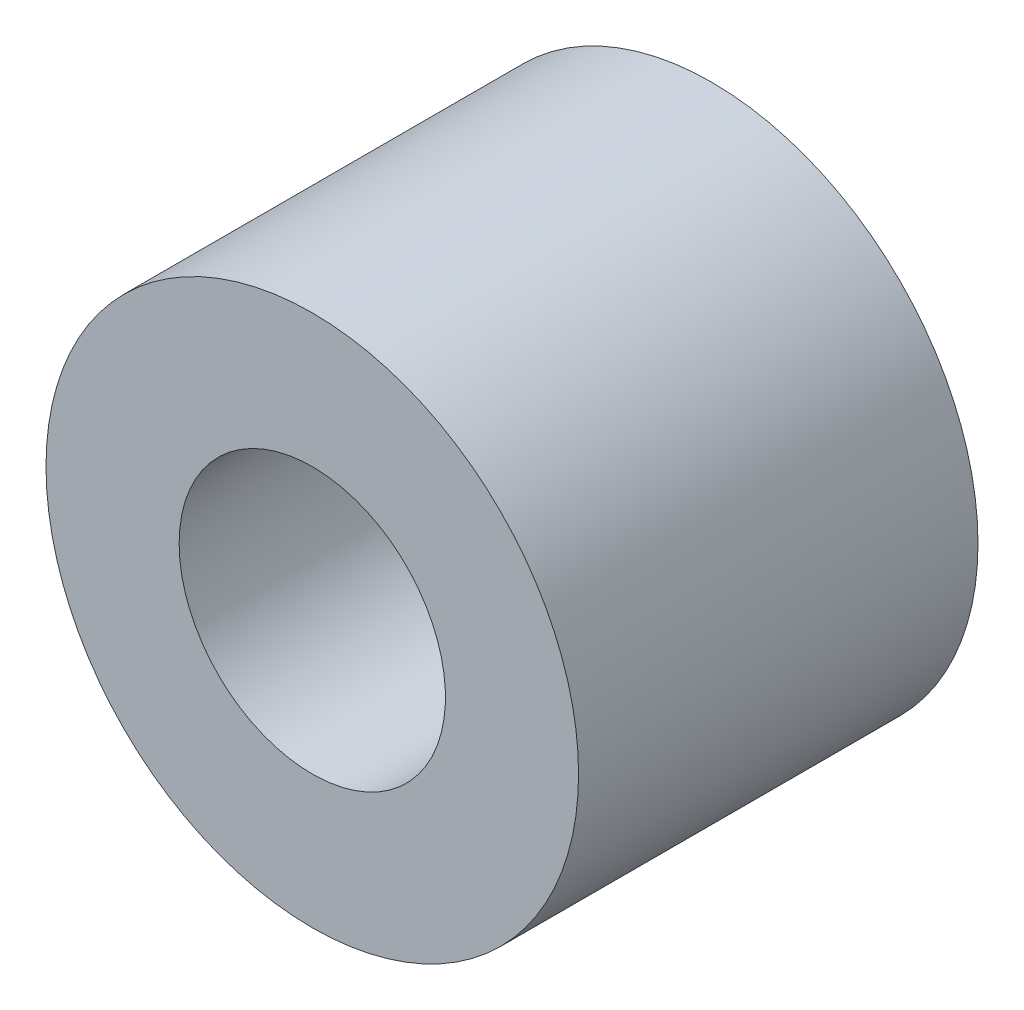
ISO-10303-21;
HEADER;
FILE_DESCRIPTION(('STEP AP214'),'2;1');
FILE_NAME('part.step','',(''),(''),'','','');
FILE_SCHEMA(('AUTOMOTIVE_DESIGN { 1 0 10303 214 1 1 1 1 }'));
ENDSEC;
DATA;
#1=APPLICATION_CONTEXT('core data for automotive mechanical design processes');
#2=APPLICATION_PROTOCOL_DEFINITION('international standard','automotive_design',2000,#1);
#3=PRODUCT_CONTEXT('',#1,'mechanical');
#4=PRODUCT('Part','Part','',(#3));
#5=PRODUCT_RELATED_PRODUCT_CATEGORY('part','',(#4));
#6=PRODUCT_DEFINITION_FORMATION('','',#4);
#7=PRODUCT_DEFINITION_CONTEXT('part definition',#1,'design');
#8=PRODUCT_DEFINITION('design','',#6,#7);
#9=PRODUCT_DEFINITION_SHAPE('','',#8);
#10=(LENGTH_UNIT() NAMED_UNIT(*) SI_UNIT(.MILLI.,.METRE.));
#11=(NAMED_UNIT(*) PLANE_ANGLE_UNIT() SI_UNIT($,.RADIAN.));
#12=(NAMED_UNIT(*) SI_UNIT($,.STERADIAN.) SOLID_ANGLE_UNIT());
#13=UNCERTAINTY_MEASURE_WITH_UNIT(LENGTH_MEASURE(1.E-05),#10,'distance_accuracy_value','');
#14=(GEOMETRIC_REPRESENTATION_CONTEXT(3) GLOBAL_UNCERTAINTY_ASSIGNED_CONTEXT((#13)) GLOBAL_UNIT_ASSIGNED_CONTEXT((#10,
#11,#12)) REPRESENTATION_CONTEXT('',''));
#15=CARTESIAN_POINT('',(0.,0.,0.));
#16=DIRECTION('',(0.,0.,1.));
#17=DIRECTION('',(1.,0.,0.));
#18=AXIS2_PLACEMENT_3D('',#15,#16,#17);
#19=CARTESIAN_POINT('',(0.,0.,4.1671875));
#20=DIRECTION('',(0.,0.,1.));
#21=DIRECTION('',(1.,0.,0.));
#22=AXIS2_PLACEMENT_3D('',#19,#20,#21);
#23=PLANE('',#22);
#24=CARTESIAN_POINT('',(0.,0.,4.1671875));
#25=DIRECTION('',(0.,0.,1.));
#26=DIRECTION('',(1.,0.,0.));
#27=AXIS2_PLACEMENT_3D('',#24,#25,#26);
#28=CIRCLE('',#27,2.38125);
#29=CARTESIAN_POINT('',(-2.38125,0.,4.1671875));
#30=VERTEX_POINT('',#29);
#31=EDGE_CURVE('E10',#30,#30,#28,.T.);
#32=ORIENTED_EDGE('',*,*,#31,.T.);
#33=EDGE_LOOP('',(#32));
#34=FACE_BOUND('',#33,.T.);
#35=CARTESIAN_POINT('',(0.,0.,4.1671875));
#36=DIRECTION('',(0.,0.,1.));
#37=DIRECTION('',(1.,0.,0.));
#38=AXIS2_PLACEMENT_3D('',#35,#36,#37);
#39=CIRCLE('',#38,1.190625);
#40=CARTESIAN_POINT('',(-1.190625,0.,4.1671875));
#41=VERTEX_POINT('',#40);
#42=EDGE_CURVE('E49',#41,#41,#39,.T.);
#43=ORIENTED_EDGE('',*,*,#42,.F.);
#44=EDGE_LOOP('',(#43));
#45=FACE_BOUND('',#44,.T.);
#46=ADVANCED_FACE('F36',(#34,#45),#23,.T.);
#47=CARTESIAN_POINT('',(0.,0.,0.5953125));
#48=DIRECTION('',(0.,0.,1.));
#49=DIRECTION('',(1.,0.,0.));
#50=AXIS2_PLACEMENT_3D('',#47,#48,#49);
#51=PLANE('',#50);
#52=CARTESIAN_POINT('',(0.,0.,0.5953125));
#53=DIRECTION('',(0.,0.,1.));
#54=DIRECTION('',(1.,0.,0.));
#55=AXIS2_PLACEMENT_3D('',#52,#53,#54);
#56=CIRCLE('',#55,2.38125);
#57=CARTESIAN_POINT('',(-2.38125,0.,0.5953125));
#58=VERTEX_POINT('',#57);
#59=EDGE_CURVE('E40',#58,#58,#56,.T.);
#60=ORIENTED_EDGE('',*,*,#59,.F.);
#61=EDGE_LOOP('',(#60));
#62=FACE_BOUND('',#61,.T.);
#63=CARTESIAN_POINT('',(0.,0.,0.5953125));
#64=DIRECTION('',(0.,0.,1.));
#65=DIRECTION('',(1.,0.,0.));
#66=AXIS2_PLACEMENT_3D('',#63,#64,#65);
#67=CIRCLE('',#66,1.190625);
#68=CARTESIAN_POINT('',(-1.190625,0.,0.5953125));
#69=VERTEX_POINT('',#68);
#70=EDGE_CURVE('E51',#69,#69,#67,.T.);
#71=ORIENTED_EDGE('',*,*,#70,.T.);
#72=EDGE_LOOP('',(#71));
#73=FACE_BOUND('',#72,.T.);
#74=ADVANCED_FACE('F63',(#62,#73),#51,.F.);
#75=CARTESIAN_POINT('',(0.,0.,4.1671875));
#76=DIRECTION('',(0.,0.,-1.));
#77=DIRECTION('',(-1.,0.,0.));
#78=AXIS2_PLACEMENT_3D('',#75,#76,#77);
#79=CYLINDRICAL_SURFACE('',#78,2.38125);
#80=CARTESIAN_POINT('',(-2.38125,0.,4.1671875));
#81=CARTESIAN_POINT('',(-2.38125,0.,4.12998046875));
#82=CARTESIAN_POINT('',(-2.38125,0.,4.0927734375));
#83=CARTESIAN_POINT('',(-2.38125,0.,4.018359375));
#84=CARTESIAN_POINT('',(-2.38125,0.,3.98115234375));
#85=CARTESIAN_POINT('',(-2.38125,0.,3.90673828125));
#86=CARTESIAN_POINT('',(-2.38125,0.,3.86953125));
#87=CARTESIAN_POINT('',(-2.38125,0.,3.7951171875));
#88=CARTESIAN_POINT('',(-2.38125,0.,3.75791015625));
#89=CARTESIAN_POINT('',(-2.38125,0.,3.68349609375));
#90=CARTESIAN_POINT('',(-2.38125,0.,3.6462890625));
#91=CARTESIAN_POINT('',(-2.38125,0.,3.571875));
#92=CARTESIAN_POINT('',(-2.38125,0.,3.53466796875));
#93=CARTESIAN_POINT('',(-2.38125,0.,3.46025390625));
#94=CARTESIAN_POINT('',(-2.38125,0.,3.423046875));
#95=CARTESIAN_POINT('',(-2.38125,0.,3.3486328125));
#96=CARTESIAN_POINT('',(-2.38125,0.,3.31142578125));
#97=CARTESIAN_POINT('',(-2.38125,0.,3.23701171875));
#98=CARTESIAN_POINT('',(-2.38125,0.,3.1998046875));
#99=CARTESIAN_POINT('',(-2.38125,0.,3.125390625));
#100=CARTESIAN_POINT('',(-2.38125,0.,3.08818359375));
#101=CARTESIAN_POINT('',(-2.38125,0.,3.01376953125));
#102=CARTESIAN_POINT('',(-2.38125,0.,2.9765625));
#103=CARTESIAN_POINT('',(-2.38125,0.,2.9021484375));
#104=CARTESIAN_POINT('',(-2.38125,0.,2.86494140625));
#105=CARTESIAN_POINT('',(-2.38125,0.,2.79052734375));
#106=CARTESIAN_POINT('',(-2.38125,0.,2.7533203125));
#107=CARTESIAN_POINT('',(-2.38125,0.,2.67890625));
#108=CARTESIAN_POINT('',(-2.38125,0.,2.64169921875));
#109=CARTESIAN_POINT('',(-2.38125,0.,2.56728515625));
#110=CARTESIAN_POINT('',(-2.38125,0.,2.530078125));
#111=CARTESIAN_POINT('',(-2.38125,0.,2.4556640625));
#112=CARTESIAN_POINT('',(-2.38125,0.,2.41845703125));
#113=CARTESIAN_POINT('',(-2.38125,0.,2.34404296875));
#114=CARTESIAN_POINT('',(-2.38125,0.,2.3068359375));
#115=CARTESIAN_POINT('',(-2.38125,0.,2.232421875));
#116=CARTESIAN_POINT('',(-2.38125,0.,2.19521484375));
#117=CARTESIAN_POINT('',(-2.38125,0.,2.12080078125));
#118=CARTESIAN_POINT('',(-2.38125,0.,2.08359375));
#119=CARTESIAN_POINT('',(-2.38125,0.,2.0091796875));
#120=CARTESIAN_POINT('',(-2.38125,0.,1.97197265625));
#121=CARTESIAN_POINT('',(-2.38125,0.,1.89755859375));
#122=CARTESIAN_POINT('',(-2.38125,0.,1.8603515625));
#123=CARTESIAN_POINT('',(-2.38125,0.,1.7859375));
#124=CARTESIAN_POINT('',(-2.38125,0.,1.74873046875));
#125=CARTESIAN_POINT('',(-2.38125,0.,1.67431640625));
#126=CARTESIAN_POINT('',(-2.38125,0.,1.637109375));
#127=CARTESIAN_POINT('',(-2.38125,0.,1.5626953125));
#128=CARTESIAN_POINT('',(-2.38125,0.,1.52548828125));
#129=CARTESIAN_POINT('',(-2.38125,0.,1.45107421875));
#130=CARTESIAN_POINT('',(-2.38125,0.,1.4138671875));
#131=CARTESIAN_POINT('',(-2.38125,0.,1.339453125));
#132=CARTESIAN_POINT('',(-2.38125,0.,1.30224609375));
#133=CARTESIAN_POINT('',(-2.38125,0.,1.22783203125));
#134=CARTESIAN_POINT('',(-2.38125,0.,1.190625));
#135=CARTESIAN_POINT('',(-2.38125,0.,1.1162109375));
#136=CARTESIAN_POINT('',(-2.38125,0.,1.07900390625));
#137=CARTESIAN_POINT('',(-2.38125,0.,1.00458984375));
#138=CARTESIAN_POINT('',(-2.38125,0.,0.9673828125));
#139=CARTESIAN_POINT('',(-2.38125,0.,0.89296875));
#140=CARTESIAN_POINT('',(-2.38125,0.,0.85576171875));
#141=CARTESIAN_POINT('',(-2.38125,0.,0.78134765625));
#142=CARTESIAN_POINT('',(-2.38125,0.,0.744140625));
#143=CARTESIAN_POINT('',(-2.38125,0.,0.6697265625));
#144=CARTESIAN_POINT('',(-2.38125,0.,0.63251953125));
#145=CARTESIAN_POINT('',(-2.38125,0.,0.5953125));
#146=B_SPLINE_CURVE_WITH_KNOTS('',3,(#80,#81,#82,#83,#84,#85,#86,#87,#88,#89,#90,#91,#92,#93,
#94,#95,#96,#97,#98,#99,#100,#101,#102,#103,#104,#105,#106,#107,#108,#109,#110,#111,#112,#113,
#114,#115,#116,#117,#118,#119,#120,#121,#122,#123,#124,#125,#126,#127,#128,#129,#130,#131,#132,
#133,#134,#135,#136,#137,#138,#139,#140,#141,#142,#143,#144,#145),.UNSPECIFIED.,.F.,.F.,(4,2,2,
2,2,2,2,2,2,2,2,2,2,2,2,2,2,2,2,2,2,2,2,2,2,2,2,2,2,2,2,2,4),(0.,0.111621093749999,
0.223242187499999,0.33486328125,0.446484374999999,0.558105468749999,0.6697265625,0.78134765625,
0.89296875,1.00458984375,1.1162109375,1.22783203125,1.339453125,1.45107421875,1.5626953125,
1.67431640625,1.7859375,1.89755859375,2.0091796875,2.12080078125,2.232421875,2.34404296875,
2.4556640625,2.56728515625,2.67890625,2.79052734375,2.9021484375,3.01376953125,3.125390625,
3.23701171875,3.3486328125,3.46025390625,3.571875),.UNSPECIFIED.);
#147=EDGE_CURVE('BSEAM38',#30,#58,#146,.T.);
#148=ORIENTED_EDGE('',*,*,#31,.F.);
#149=ORIENTED_EDGE('',*,*,#59,.T.);
#150=ORIENTED_EDGE('',*,*,#147,.T.);
#151=ORIENTED_EDGE('',*,*,#147,.F.);
#152=EDGE_LOOP('',(#148,#150,#149,#151));
#153=FACE_BOUND('',#152,.T.);
#154=ADVANCED_FACE('F38',(#153),#79,.T.);
#155=CARTESIAN_POINT('',(0.,0.,4.1671875));
#156=DIRECTION('',(0.,0.,-1.));
#157=DIRECTION('',(-1.,0.,0.));
#158=AXIS2_PLACEMENT_3D('',#155,#156,#157);
#159=CYLINDRICAL_SURFACE('',#158,1.190625);
#160=CARTESIAN_POINT('',(-1.190625,0.,4.1671875));
#161=CARTESIAN_POINT('',(-1.190625,0.,4.12998046875));
#162=CARTESIAN_POINT('',(-1.190625,0.,4.0927734375));
#163=CARTESIAN_POINT('',(-1.190625,0.,4.018359375));
#164=CARTESIAN_POINT('',(-1.190625,0.,3.98115234375));
#165=CARTESIAN_POINT('',(-1.190625,0.,3.90673828125));
#166=CARTESIAN_POINT('',(-1.190625,0.,3.86953125));
#167=CARTESIAN_POINT('',(-1.190625,0.,3.7951171875));
#168=CARTESIAN_POINT('',(-1.190625,0.,3.75791015625));
#169=CARTESIAN_POINT('',(-1.190625,0.,3.68349609375));
#170=CARTESIAN_POINT('',(-1.190625,0.,3.6462890625));
#171=CARTESIAN_POINT('',(-1.190625,0.,3.571875));
#172=CARTESIAN_POINT('',(-1.190625,0.,3.53466796875));
#173=CARTESIAN_POINT('',(-1.190625,0.,3.46025390625));
#174=CARTESIAN_POINT('',(-1.190625,0.,3.423046875));
#175=CARTESIAN_POINT('',(-1.190625,0.,3.3486328125));
#176=CARTESIAN_POINT('',(-1.190625,0.,3.31142578125));
#177=CARTESIAN_POINT('',(-1.190625,0.,3.23701171875));
#178=CARTESIAN_POINT('',(-1.190625,0.,3.1998046875));
#179=CARTESIAN_POINT('',(-1.190625,0.,3.125390625));
#180=CARTESIAN_POINT('',(-1.190625,0.,3.08818359375));
#181=CARTESIAN_POINT('',(-1.190625,0.,3.01376953125));
#182=CARTESIAN_POINT('',(-1.190625,0.,2.9765625));
#183=CARTESIAN_POINT('',(-1.190625,0.,2.9021484375));
#184=CARTESIAN_POINT('',(-1.190625,0.,2.86494140625));
#185=CARTESIAN_POINT('',(-1.190625,0.,2.79052734375));
#186=CARTESIAN_POINT('',(-1.190625,0.,2.7533203125));
#187=CARTESIAN_POINT('',(-1.190625,0.,2.67890625));
#188=CARTESIAN_POINT('',(-1.190625,0.,2.64169921875));
#189=CARTESIAN_POINT('',(-1.190625,0.,2.56728515625));
#190=CARTESIAN_POINT('',(-1.190625,0.,2.530078125));
#191=CARTESIAN_POINT('',(-1.190625,0.,2.4556640625));
#192=CARTESIAN_POINT('',(-1.190625,0.,2.41845703125));
#193=CARTESIAN_POINT('',(-1.190625,0.,2.34404296875));
#194=CARTESIAN_POINT('',(-1.190625,0.,2.3068359375));
#195=CARTESIAN_POINT('',(-1.190625,0.,2.232421875));
#196=CARTESIAN_POINT('',(-1.190625,0.,2.19521484375));
#197=CARTESIAN_POINT('',(-1.190625,0.,2.12080078125));
#198=CARTESIAN_POINT('',(-1.190625,0.,2.08359375));
#199=CARTESIAN_POINT('',(-1.190625,0.,2.0091796875));
#200=CARTESIAN_POINT('',(-1.190625,0.,1.97197265625));
#201=CARTESIAN_POINT('',(-1.190625,0.,1.89755859375));
#202=CARTESIAN_POINT('',(-1.190625,0.,1.8603515625));
#203=CARTESIAN_POINT('',(-1.190625,0.,1.7859375));
#204=CARTESIAN_POINT('',(-1.190625,0.,1.74873046875));
#205=CARTESIAN_POINT('',(-1.190625,0.,1.67431640625));
#206=CARTESIAN_POINT('',(-1.190625,0.,1.637109375));
#207=CARTESIAN_POINT('',(-1.190625,0.,1.5626953125));
#208=CARTESIAN_POINT('',(-1.190625,0.,1.52548828125));
#209=CARTESIAN_POINT('',(-1.190625,0.,1.45107421875));
#210=CARTESIAN_POINT('',(-1.190625,0.,1.4138671875));
#211=CARTESIAN_POINT('',(-1.190625,0.,1.339453125));
#212=CARTESIAN_POINT('',(-1.190625,0.,1.30224609375));
#213=CARTESIAN_POINT('',(-1.190625,0.,1.22783203125));
#214=CARTESIAN_POINT('',(-1.190625,0.,1.190625));
#215=CARTESIAN_POINT('',(-1.190625,0.,1.1162109375));
#216=CARTESIAN_POINT('',(-1.190625,0.,1.07900390625));
#217=CARTESIAN_POINT('',(-1.190625,0.,1.00458984375));
#218=CARTESIAN_POINT('',(-1.190625,0.,0.9673828125));
#219=CARTESIAN_POINT('',(-1.190625,0.,0.89296875));
#220=CARTESIAN_POINT('',(-1.190625,0.,0.85576171875));
#221=CARTESIAN_POINT('',(-1.190625,0.,0.78134765625));
#222=CARTESIAN_POINT('',(-1.190625,0.,0.744140625));
#223=CARTESIAN_POINT('',(-1.190625,0.,0.6697265625));
#224=CARTESIAN_POINT('',(-1.190625,0.,0.63251953125));
#225=CARTESIAN_POINT('',(-1.190625,0.,0.5953125));
#226=B_SPLINE_CURVE_WITH_KNOTS('',3,(#160,#161,#162,#163,#164,#165,#166,#167,#168,#169,#170,
#171,#172,#173,#174,#175,#176,#177,#178,#179,#180,#181,#182,#183,#184,#185,#186,#187,#188,#189,
#190,#191,#192,#193,#194,#195,#196,#197,#198,#199,#200,#201,#202,#203,#204,#205,#206,#207,#208,
#209,#210,#211,#212,#213,#214,#215,#216,#217,#218,#219,#220,#221,#222,#223,#224,#225),
.UNSPECIFIED.,.F.,.F.,(4,2,2,2,2,2,2,2,2,2,2,2,2,2,2,2,2,2,2,2,2,2,2,2,2,2,2,2,2,2,2,2,4),(0.,
0.11162109375,0.2232421875,0.334863281250001,0.446484375,0.55810546875,0.6697265625,
0.78134765625,0.892968750000001,1.00458984375,1.1162109375,1.22783203125,1.339453125,
1.45107421875,1.5626953125,1.67431640625,1.7859375,1.89755859375,2.0091796875,2.12080078125,
2.232421875,2.34404296875,2.4556640625,2.56728515625,2.67890625,2.79052734375,2.9021484375,
3.01376953125,3.125390625,3.23701171875,3.3486328125,3.46025390625,3.571875),.UNSPECIFIED.);
#227=EDGE_CURVE('BSEAM59',#41,#69,#226,.T.);
#228=ORIENTED_EDGE('',*,*,#42,.T.);
#229=ORIENTED_EDGE('',*,*,#70,.F.);
#230=ORIENTED_EDGE('',*,*,#227,.T.);
#231=ORIENTED_EDGE('',*,*,#227,.F.);
#232=EDGE_LOOP('',(#228,#230,#229,#231));
#233=FACE_BOUND('',#232,.T.);
#234=ADVANCED_FACE('F59',(#233),#159,.F.);
#235=CLOSED_SHELL('',(#46,#74,#154,#234));
#236=MANIFOLD_SOLID_BREP('B2',#235);
#237=ADVANCED_BREP_SHAPE_REPRESENTATION('',(#18,#236),#14);
#238=SHAPE_DEFINITION_REPRESENTATION(#9,#237);
ENDSEC;
END-ISO-10303-21;
